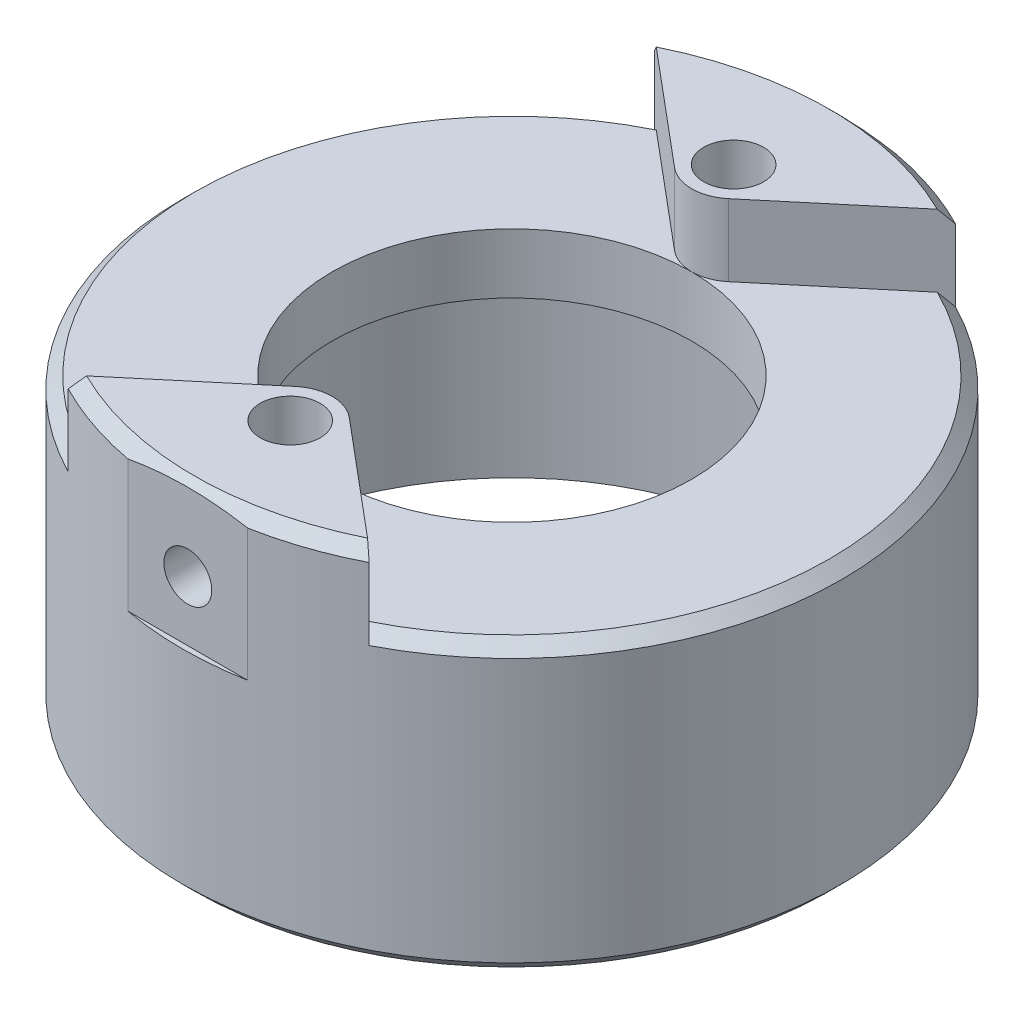
ISO-10303-21;
HEADER;
FILE_DESCRIPTION(('STEP AP214'),'2;1');
FILE_NAME('part.step','',(''),(''),'','','');
FILE_SCHEMA(('AUTOMOTIVE_DESIGN { 1 0 10303 214 1 1 1 1 }'));
ENDSEC;
DATA;
#1=APPLICATION_CONTEXT('core data for automotive mechanical design processes');
#2=APPLICATION_PROTOCOL_DEFINITION('international standard','automotive_design',2000,#1);
#3=PRODUCT_CONTEXT('',#1,'mechanical');
#4=PRODUCT('Part','Part','',(#3));
#5=PRODUCT_RELATED_PRODUCT_CATEGORY('part','',(#4));
#6=PRODUCT_DEFINITION_FORMATION('','',#4);
#7=PRODUCT_DEFINITION_CONTEXT('part definition',#1,'design');
#8=PRODUCT_DEFINITION('design','',#6,#7);
#9=PRODUCT_DEFINITION_SHAPE('','',#8);
#10=(LENGTH_UNIT() NAMED_UNIT(*) SI_UNIT(.MILLI.,.METRE.));
#11=(NAMED_UNIT(*) PLANE_ANGLE_UNIT() SI_UNIT($,.RADIAN.));
#12=(NAMED_UNIT(*) SI_UNIT($,.STERADIAN.) SOLID_ANGLE_UNIT());
#13=UNCERTAINTY_MEASURE_WITH_UNIT(LENGTH_MEASURE(1.E-05),#10,'distance_accuracy_value','');
#14=(GEOMETRIC_REPRESENTATION_CONTEXT(3) GLOBAL_UNCERTAINTY_ASSIGNED_CONTEXT((#13)) GLOBAL_UNIT_ASSIGNED_CONTEXT((#10,
#11,#12)) REPRESENTATION_CONTEXT('',''));
#15=CARTESIAN_POINT('',(0.,0.,0.));
#16=DIRECTION('',(0.,0.,1.));
#17=DIRECTION('',(1.,0.,0.));
#18=AXIS2_PLACEMENT_3D('',#15,#16,#17);
#19=CARTESIAN_POINT('',(0.,30.,0.));
#20=DIRECTION('',(0.,-1.,0.));
#21=DIRECTION('',(0.,0.,-1.));
#22=AXIS2_PLACEMENT_3D('',#19,#20,#21);
#23=CYLINDRICAL_SURFACE('',#22,27.5);
#24=CARTESIAN_POINT('',(0.,1.00000000000001,0.));
#25=DIRECTION('',(0.,1.,0.));
#26=DIRECTION('',(0.,0.,1.));
#27=AXIS2_PLACEMENT_3D('',#24,#25,#26);
#28=CIRCLE('',#27,27.5);
#29=CARTESIAN_POINT('',(0.,1.00000000000001,27.5));
#30=VERTEX_POINT('',#29);
#31=EDGE_CURVE('E453',#30,#30,#28,.T.);
#32=ORIENTED_EDGE('',*,*,#31,.T.);
#33=EDGE_LOOP('',(#32));
#34=FACE_BOUND('',#33,.T.);
#35=DIRECTION('',(0.,1.,0.));
#36=VECTOR('',#35,1.);
#37=CARTESIAN_POINT('',(12.55557835335,24.,24.4664556528503));
#38=LINE('',#37,#36);
#39=CARTESIAN_POINT('',(12.55557835335,23.,24.4664556528503));
#40=VERTEX_POINT('',#39);
#41=CARTESIAN_POINT('',(12.55557835335,29.,24.4664556528503));
#42=VERTEX_POINT('',#41);
#43=EDGE_CURVE('E247',#40,#42,#38,.T.);
#44=ORIENTED_EDGE('',*,*,#43,.T.);
#45=CARTESIAN_POINT('',(0.,29.,0.));
#46=DIRECTION('',(0.,1.,0.));
#47=DIRECTION('',(0.,0.,1.));
#48=AXIS2_PLACEMENT_3D('',#45,#46,#47);
#49=CIRCLE('',#48,27.5);
#50=CARTESIAN_POINT('',(5.,29.,27.0416345659799));
#51=VERTEX_POINT('',#50);
#52=EDGE_CURVE('E180',#42,#51,#49,.F.);
#53=ORIENTED_EDGE('',*,*,#52,.T.);
#54=DIRECTION('',(0.,-1.,0.));
#55=VECTOR('',#54,1.);
#56=CARTESIAN_POINT('',(5.,30.,27.0416345659799));
#57=LINE('',#56,#55);
#58=CARTESIAN_POINT('',(5.,18.,27.0416345659799));
#59=VERTEX_POINT('',#58);
#60=EDGE_CURVE('E173',#51,#59,#57,.T.);
#61=ORIENTED_EDGE('',*,*,#60,.T.);
#62=CARTESIAN_POINT('',(0.,18.,0.));
#63=DIRECTION('',(0.,1.,0.));
#64=DIRECTION('',(0.,0.,1.));
#65=AXIS2_PLACEMENT_3D('',#62,#63,#64);
#66=CIRCLE('',#65,27.5);
#67=CARTESIAN_POINT('',(-5.,18.,27.0416345659799));
#68=VERTEX_POINT('',#67);
#69=EDGE_CURVE('E172',#68,#59,#66,.T.);
#70=ORIENTED_EDGE('',*,*,#69,.F.);
#71=DIRECTION('',(0.,-1.,0.));
#72=VECTOR('',#71,1.);
#73=CARTESIAN_POINT('',(-5.,30.,27.0416345659799));
#74=LINE('',#73,#72);
#75=CARTESIAN_POINT('',(-5.,29.,27.0416345659799));
#76=VERTEX_POINT('',#75);
#77=EDGE_CURVE('E182',#76,#68,#74,.T.);
#78=ORIENTED_EDGE('',*,*,#77,.F.);
#79=CARTESIAN_POINT('',(0.,29.,0.));
#80=DIRECTION('',(0.,1.,0.));
#81=DIRECTION('',(0.,0.,1.));
#82=AXIS2_PLACEMENT_3D('',#79,#80,#81);
#83=CIRCLE('',#82,27.5);
#84=CARTESIAN_POINT('',(-12.5555783533498,29.,24.4664556528504));
#85=VERTEX_POINT('',#84);
#86=EDGE_CURVE('E456',#76,#85,#83,.F.);
#87=ORIENTED_EDGE('',*,*,#86,.T.);
#88=DIRECTION('',(0.,1.,0.));
#89=VECTOR('',#88,1.);
#90=CARTESIAN_POINT('',(-12.5555783533498,24.,24.4664556528504));
#91=LINE('',#90,#89);
#92=CARTESIAN_POINT('',(-12.5555783533498,23.,24.4664556528504));
#93=VERTEX_POINT('',#92);
#94=EDGE_CURVE('E245',#93,#85,#91,.T.);
#95=ORIENTED_EDGE('',*,*,#94,.F.);
#96=CARTESIAN_POINT('',(0.,23.,0.));
#97=DIRECTION('',(0.,1.,0.));
#98=DIRECTION('',(0.,0.,1.));
#99=AXIS2_PLACEMENT_3D('',#96,#97,#98);
#100=CIRCLE('',#99,27.5);
#101=CARTESIAN_POINT('',(-12.5555783533498,23.,-24.4664556528504));
#102=VERTEX_POINT('',#101);
#103=EDGE_CURVE('E449',#93,#102,#100,.F.);
#104=ORIENTED_EDGE('',*,*,#103,.T.);
#105=DIRECTION('',(0.,1.,0.));
#106=VECTOR('',#105,1.);
#107=CARTESIAN_POINT('',(-12.5555783533498,24.,-24.4664556528504));
#108=LINE('',#107,#106);
#109=CARTESIAN_POINT('',(-12.5555783533498,29.,-24.4664556528504));
#110=VERTEX_POINT('',#109);
#111=EDGE_CURVE('E239',#102,#110,#108,.T.);
#112=ORIENTED_EDGE('',*,*,#111,.T.);
#113=CARTESIAN_POINT('',(0.,29.,0.));
#114=DIRECTION('',(0.,1.,0.));
#115=DIRECTION('',(0.,0.,1.));
#116=AXIS2_PLACEMENT_3D('',#113,#114,#115);
#117=CIRCLE('',#116,27.5);
#118=CARTESIAN_POINT('',(-5.,29.,-27.0416345659799));
#119=VERTEX_POINT('',#118);
#120=EDGE_CURVE('E451',#110,#119,#117,.F.);
#121=ORIENTED_EDGE('',*,*,#120,.T.);
#122=DIRECTION('',(0.,-1.,0.));
#123=VECTOR('',#122,1.);
#124=CARTESIAN_POINT('',(-5.,30.,-27.0416345659799));
#125=LINE('',#124,#123);
#126=CARTESIAN_POINT('',(-5.,18.,-27.0416345659799));
#127=VERTEX_POINT('',#126);
#128=EDGE_CURVE('E194',#119,#127,#125,.T.);
#129=ORIENTED_EDGE('',*,*,#128,.T.);
#130=CARTESIAN_POINT('',(0.,18.,0.));
#131=DIRECTION('',(0.,1.,0.));
#132=DIRECTION('',(0.,0.,-1.));
#133=AXIS2_PLACEMENT_3D('',#130,#131,#132);
#134=CIRCLE('',#133,27.5);
#135=CARTESIAN_POINT('',(5.,18.,-27.0416345659799));
#136=VERTEX_POINT('',#135);
#137=EDGE_CURVE('E190',#136,#127,#134,.T.);
#138=ORIENTED_EDGE('',*,*,#137,.F.);
#139=DIRECTION('',(0.,-1.,0.));
#140=VECTOR('',#139,1.);
#141=CARTESIAN_POINT('',(5.,30.,-27.0416345659799));
#142=LINE('',#141,#140);
#143=CARTESIAN_POINT('',(5.,29.,-27.0416345659799));
#144=VERTEX_POINT('',#143);
#145=EDGE_CURVE('E198',#144,#136,#142,.T.);
#146=ORIENTED_EDGE('',*,*,#145,.F.);
#147=CARTESIAN_POINT('',(0.,29.,0.));
#148=DIRECTION('',(0.,1.,0.));
#149=DIRECTION('',(0.,0.,1.));
#150=AXIS2_PLACEMENT_3D('',#147,#148,#149);
#151=CIRCLE('',#150,27.5);
#152=CARTESIAN_POINT('',(12.55557835335,29.,-24.4664556528503));
#153=VERTEX_POINT('',#152);
#154=EDGE_CURVE('E447',#144,#153,#151,.F.);
#155=ORIENTED_EDGE('',*,*,#154,.T.);
#156=DIRECTION('',(0.,1.,0.));
#157=VECTOR('',#156,1.);
#158=CARTESIAN_POINT('',(12.55557835335,24.,-24.4664556528503));
#159=LINE('',#158,#157);
#160=CARTESIAN_POINT('',(12.55557835335,23.,-24.4664556528503));
#161=VERTEX_POINT('',#160);
#162=EDGE_CURVE('E252',#161,#153,#159,.T.);
#163=ORIENTED_EDGE('',*,*,#162,.F.);
#164=CARTESIAN_POINT('',(0.,23.,0.));
#165=DIRECTION('',(0.,1.,0.));
#166=DIRECTION('',(0.,0.,1.));
#167=AXIS2_PLACEMENT_3D('',#164,#165,#166);
#168=CIRCLE('',#167,27.5);
#169=EDGE_CURVE('E295',#161,#40,#168,.F.);
#170=ORIENTED_EDGE('',*,*,#169,.T.);
#171=EDGE_LOOP('',(#44,#53,#61,#70,#78,#87,#95,#104,#112,#121,#129,#138,#146,#155,#163,#170));
#172=FACE_BOUND('',#171,.T.);
#173=ADVANCED_FACE('F43',(#34,#172),#23,.T.);
#174=CARTESIAN_POINT('',(0.,30.,0.));
#175=DIRECTION('',(0.,-1.,0.));
#176=DIRECTION('',(0.,0.,-1.));
#177=AXIS2_PLACEMENT_3D('',#174,#175,#176);
#178=CYLINDRICAL_SURFACE('',#177,15.);
#179=CARTESIAN_POINT('',(0.,19.,0.));
#180=DIRECTION('',(0.,-1.,0.));
#181=DIRECTION('',(0.,0.,-1.));
#182=AXIS2_PLACEMENT_3D('',#179,#180,#181);
#183=CIRCLE('',#182,15.);
#184=CARTESIAN_POINT('',(0.,19.,-15.));
#185=VERTEX_POINT('',#184);
#186=EDGE_CURVE('E275',#185,#185,#183,.T.);
#187=ORIENTED_EDGE('',*,*,#186,.T.);
#188=EDGE_LOOP('',(#187));
#189=FACE_BOUND('',#188,.T.);
#190=CARTESIAN_POINT('',(0.,24.,0.));
#191=DIRECTION('',(0.,1.,0.));
#192=DIRECTION('',(0.,0.,1.));
#193=AXIS2_PLACEMENT_3D('',#190,#191,#192);
#194=CIRCLE('',#193,15.);
#195=CARTESIAN_POINT('',(0.,24.,-15.));
#196=VERTEX_POINT('',#195);
#197=CARTESIAN_POINT('',(0.,24.,15.));
#198=VERTEX_POINT('',#197);
#199=EDGE_CURVE('E256',#196,#198,#194,.T.);
#200=ORIENTED_EDGE('',*,*,#199,.T.);
#201=EDGE_CURVE('E261',#198,#196,#194,.T.);
#202=ORIENTED_EDGE('',*,*,#201,.T.);
#203=EDGE_LOOP('',(#200,#202));
#204=FACE_BOUND('',#203,.T.);
#205=ADVANCED_FACE('F367',(#189,#204),#178,.F.);
#206=CARTESIAN_POINT('',(0.,30.,0.));
#207=DIRECTION('',(0.,1.,0.));
#208=DIRECTION('',(0.,0.,1.));
#209=AXIS2_PLACEMENT_3D('',#206,#207,#208);
#210=PLANE('',#209);
#211=CARTESIAN_POINT('',(0.,30.,0.));
#212=DIRECTION('',(0.,1.,0.));
#213=DIRECTION('',(0.,0.,1.));
#214=AXIS2_PLACEMENT_3D('',#211,#212,#213);
#215=CIRCLE('',#214,26.5);
#216=CARTESIAN_POINT('',(-11.7215959154197,30.,23.7666612967749));
#217=VERTEX_POINT('',#216);
#218=CARTESIAN_POINT('',(11.7215959154198,30.,23.7666612967748));
#219=VERTEX_POINT('',#218);
#220=EDGE_CURVE('E283',#217,#219,#215,.T.);
#221=ORIENTED_EDGE('',*,*,#220,.T.);
#222=DIRECTION('',(0.766044443118984,0.,0.642787609686532));
#223=VECTOR('',#222,1.);
#224=CARTESIAN_POINT('',(2.24975663390286,30.,15.8188444490836));
#225=LINE('',#224,#223);
#226=CARTESIAN_POINT('',(2.24975663390286,30.,15.8188444490836));
#227=VERTEX_POINT('',#226);
#228=EDGE_CURVE('E230',#227,#219,#225,.T.);
#229=ORIENTED_EDGE('',*,*,#228,.F.);
#230=CARTESIAN_POINT('',(0.,30.,18.5));
#231=DIRECTION('',(0.,1.,0.));
#232=DIRECTION('',(0.,0.,1.));
#233=AXIS2_PLACEMENT_3D('',#230,#231,#232);
#234=CIRCLE('',#233,3.5);
#235=CARTESIAN_POINT('',(-2.2497566339029,30.,15.8188444490836));
#236=VERTEX_POINT('',#235);
#237=EDGE_CURVE('E227',#227,#236,#234,.T.);
#238=ORIENTED_EDGE('',*,*,#237,.T.);
#239=DIRECTION('',(-0.766044443118975,0.,0.642787609686543));
#240=VECTOR('',#239,1.);
#241=CARTESIAN_POINT('',(-2.2497566339029,30.,15.8188444490836));
#242=LINE('',#241,#240);
#243=EDGE_CURVE('E235',#236,#217,#242,.T.);
#244=ORIENTED_EDGE('',*,*,#243,.T.);
#245=EDGE_LOOP('',(#221,#229,#238,#244));
#246=FACE_BOUND('',#245,.T.);
#247=CARTESIAN_POINT('',(0.,30.,18.5));
#248=DIRECTION('',(0.,1.,0.));
#249=DIRECTION('',(0.,0.,1.));
#250=AXIS2_PLACEMENT_3D('',#247,#248,#249);
#251=CIRCLE('',#250,2.5);
#252=CARTESIAN_POINT('',(0.,30.,21.));
#253=VERTEX_POINT('',#252);
#254=EDGE_CURVE('E274',#253,#253,#251,.T.);
#255=ORIENTED_EDGE('',*,*,#254,.F.);
#256=EDGE_LOOP('',(#255));
#257=FACE_BOUND('',#256,.T.);
#258=ADVANCED_FACE('F380',(#246,#257),#210,.T.);
#259=CARTESIAN_POINT('',(0.,30.,-18.5));
#260=DIRECTION('',(0.,-1.,0.));
#261=DIRECTION('',(0.,0.,-1.));
#262=AXIS2_PLACEMENT_3D('',#259,#260,#261);
#263=CYLINDRICAL_SURFACE('',#262,2.5);
#264=CARTESIAN_POINT('',(0.,30.,-18.5));
#265=DIRECTION('',(0.,1.,0.));
#266=DIRECTION('',(0.,0.,1.));
#267=AXIS2_PLACEMENT_3D('',#264,#265,#266);
#268=CIRCLE('',#267,2.5);
#269=CARTESIAN_POINT('',(0.,30.,-16.));
#270=VERTEX_POINT('',#269);
#271=EDGE_CURVE('E279',#270,#270,#268,.T.);
#272=ORIENTED_EDGE('',*,*,#271,.T.);
#273=EDGE_LOOP('',(#272));
#274=FACE_BOUND('',#273,.T.);
#275=CARTESIAN_POINT('',(0.,19.,-18.5));
#276=DIRECTION('',(0.,-1.,0.));
#277=DIRECTION('',(0.,0.,-1.));
#278=AXIS2_PLACEMENT_3D('',#275,#276,#277);
#279=CIRCLE('',#278,2.5);
#280=CARTESIAN_POINT('',(0.,19.,-21.));
#281=VERTEX_POINT('',#280);
#282=EDGE_CURVE('E267',#281,#281,#279,.T.);
#283=ORIENTED_EDGE('',*,*,#282,.T.);
#284=EDGE_LOOP('',(#283));
#285=FACE_BOUND('',#284,.T.);
#286=ADVANCED_FACE('F395',(#274,#285),#263,.F.);
#287=CARTESIAN_POINT('',(0.,30.,18.5));
#288=DIRECTION('',(0.,-1.,0.));
#289=DIRECTION('',(0.,0.,-1.));
#290=AXIS2_PLACEMENT_3D('',#287,#288,#289);
#291=CYLINDRICAL_SURFACE('',#290,2.5);
#292=ORIENTED_EDGE('',*,*,#254,.T.);
#293=EDGE_LOOP('',(#292));
#294=FACE_BOUND('',#293,.T.);
#295=CARTESIAN_POINT('',(0.,19.,18.5));
#296=DIRECTION('',(0.,-1.,0.));
#297=DIRECTION('',(0.,0.,-1.));
#298=AXIS2_PLACEMENT_3D('',#295,#296,#297);
#299=CIRCLE('',#298,2.5);
#300=CARTESIAN_POINT('',(0.,19.,16.));
#301=VERTEX_POINT('',#300);
#302=EDGE_CURVE('E264',#301,#301,#299,.T.);
#303=ORIENTED_EDGE('',*,*,#302,.T.);
#304=EDGE_LOOP('',(#303));
#305=FACE_BOUND('',#304,.T.);
#306=ADVANCED_FACE('F386',(#294,#305),#291,.F.);
#307=CARTESIAN_POINT('',(0.,30.,0.));
#308=DIRECTION('',(0.,1.,0.));
#309=DIRECTION('',(0.,0.,1.));
#310=AXIS2_PLACEMENT_3D('',#307,#308,#309);
#311=CIRCLE('',#310,26.5);
#312=CARTESIAN_POINT('',(11.7215959154199,30.,-23.7666612967748));
#313=VERTEX_POINT('',#312);
#314=CARTESIAN_POINT('',(-11.7215959154197,30.,-23.7666612967749));
#315=VERTEX_POINT('',#314);
#316=EDGE_CURVE('E497',#313,#315,#311,.T.);
#317=ORIENTED_EDGE('',*,*,#316,.T.);
#318=DIRECTION('',(-0.766044443118975,0.,-0.642787609686543));
#319=VECTOR('',#318,1.);
#320=CARTESIAN_POINT('',(-2.2497566339029,30.,-15.8188444490836));
#321=LINE('',#320,#319);
#322=CARTESIAN_POINT('',(-2.2497566339029,30.,-15.8188444490836));
#323=VERTEX_POINT('',#322);
#324=EDGE_CURVE('E232',#323,#315,#321,.T.);
#325=ORIENTED_EDGE('',*,*,#324,.F.);
#326=CARTESIAN_POINT('',(0.,30.,-18.5));
#327=DIRECTION('',(0.,1.,0.));
#328=DIRECTION('',(0.,0.,1.));
#329=AXIS2_PLACEMENT_3D('',#326,#327,#328);
#330=CIRCLE('',#329,3.5);
#331=CARTESIAN_POINT('',(2.24975663390286,30.,-15.8188444490836));
#332=VERTEX_POINT('',#331);
#333=EDGE_CURVE('E177',#323,#332,#330,.T.);
#334=ORIENTED_EDGE('',*,*,#333,.T.);
#335=DIRECTION('',(0.766044443118984,0.,-0.642787609686532));
#336=VECTOR('',#335,1.);
#337=CARTESIAN_POINT('',(2.24975663390286,30.,-15.8188444490836));
#338=LINE('',#337,#336);
#339=EDGE_CURVE('E221',#332,#313,#338,.T.);
#340=ORIENTED_EDGE('',*,*,#339,.T.);
#341=EDGE_LOOP('',(#317,#325,#334,#340));
#342=FACE_BOUND('',#341,.T.);
#343=ORIENTED_EDGE('',*,*,#271,.F.);
#344=EDGE_LOOP('',(#343));
#345=FACE_BOUND('',#344,.T.);
#346=ADVANCED_FACE('F387',(#342,#345),#210,.T.);
#347=CARTESIAN_POINT('',(0.,0.,0.));
#348=DIRECTION('',(0.,1.,0.));
#349=DIRECTION('',(0.,0.,1.));
#350=AXIS2_PLACEMENT_3D('',#347,#348,#349);
#351=PLANE('',#350);
#352=CARTESIAN_POINT('',(0.,0.,0.));
#353=DIRECTION('',(0.,1.,0.));
#354=DIRECTION('',(0.,0.,1.));
#355=AXIS2_PLACEMENT_3D('',#352,#353,#354);
#356=CIRCLE('',#355,26.5);
#357=CARTESIAN_POINT('',(0.,0.,26.5));
#358=VERTEX_POINT('',#357);
#359=EDGE_CURVE('E439',#358,#358,#356,.F.);
#360=ORIENTED_EDGE('',*,*,#359,.T.);
#361=EDGE_LOOP('',(#360));
#362=FACE_BOUND('',#361,.T.);
#363=CARTESIAN_POINT('',(0.,0.,0.));
#364=DIRECTION('',(0.,-1.,0.));
#365=DIRECTION('',(0.,0.,-1.));
#366=AXIS2_PLACEMENT_3D('',#363,#364,#365);
#367=CIRCLE('',#366,23.5);
#368=CARTESIAN_POINT('',(0.,0.,-23.5));
#369=VERTEX_POINT('',#368);
#370=EDGE_CURVE('E266',#369,#369,#367,.T.);
#371=ORIENTED_EDGE('',*,*,#370,.F.);
#372=EDGE_LOOP('',(#371));
#373=FACE_BOUND('',#372,.T.);
#374=ADVANCED_FACE('F385',(#362,#373),#351,.F.);
#375=CARTESIAN_POINT('',(0.,19.,0.));
#376=DIRECTION('',(0.,-1.,0.));
#377=DIRECTION('',(0.,0.,-1.));
#378=AXIS2_PLACEMENT_3D('',#375,#376,#377);
#379=CYLINDRICAL_SURFACE('',#378,23.5);
#380=CARTESIAN_POINT('',(0.,19.,0.));
#381=DIRECTION('',(0.,-1.,0.));
#382=DIRECTION('',(0.,0.,-1.));
#383=AXIS2_PLACEMENT_3D('',#380,#381,#382);
#384=CIRCLE('',#383,23.5);
#385=CARTESIAN_POINT('',(0.,19.,-23.5));
#386=VERTEX_POINT('',#385);
#387=EDGE_CURVE('E265',#386,#386,#384,.T.);
#388=ORIENTED_EDGE('',*,*,#387,.F.);
#389=EDGE_LOOP('',(#388));
#390=FACE_BOUND('',#389,.T.);
#391=ORIENTED_EDGE('',*,*,#370,.T.);
#392=EDGE_LOOP('',(#391));
#393=FACE_BOUND('',#392,.T.);
#394=ADVANCED_FACE('F384',(#390,#393),#379,.F.);
#395=CARTESIAN_POINT('',(0.,19.,0.));
#396=DIRECTION('',(0.,-1.,0.));
#397=DIRECTION('',(0.,0.,-1.));
#398=AXIS2_PLACEMENT_3D('',#395,#396,#397);
#399=PLANE('',#398);
#400=ORIENTED_EDGE('',*,*,#186,.F.);
#401=EDGE_LOOP('',(#400));
#402=FACE_BOUND('',#401,.T.);
#403=ORIENTED_EDGE('',*,*,#282,.F.);
#404=EDGE_LOOP('',(#403));
#405=FACE_BOUND('',#404,.T.);
#406=ORIENTED_EDGE('',*,*,#302,.F.);
#407=EDGE_LOOP('',(#406));
#408=FACE_BOUND('',#407,.T.);
#409=ORIENTED_EDGE('',*,*,#387,.T.);
#410=EDGE_LOOP('',(#409));
#411=FACE_BOUND('',#410,.T.);
#412=ADVANCED_FACE('F397',(#402,#405,#408,#411),#399,.T.);
#413=CARTESIAN_POINT('',(0.,24.,-18.5));
#414=DIRECTION('',(0.,1.,0.));
#415=DIRECTION('',(0.,0.,1.));
#416=AXIS2_PLACEMENT_3D('',#413,#414,#415);
#417=CYLINDRICAL_SURFACE('',#416,3.5);
#418=CARTESIAN_POINT('',(0.,24.,-18.5));
#419=DIRECTION('',(0.,1.,0.));
#420=DIRECTION('',(0.,0.,1.));
#421=AXIS2_PLACEMENT_3D('',#418,#419,#420);
#422=CIRCLE('',#421,3.5);
#423=CARTESIAN_POINT('',(-2.2497566339029,24.,-15.8188444490836));
#424=VERTEX_POINT('',#423);
#425=EDGE_CURVE('E204',#424,#196,#422,.T.);
#426=ORIENTED_EDGE('',*,*,#425,.T.);
#427=CARTESIAN_POINT('',(2.24975663390286,24.,-15.8188444490836));
#428=VERTEX_POINT('',#427);
#429=EDGE_CURVE('E208',#196,#428,#422,.T.);
#430=ORIENTED_EDGE('',*,*,#429,.T.);
#431=DIRECTION('',(0.,1.,0.));
#432=VECTOR('',#431,1.);
#433=CARTESIAN_POINT('',(2.24975663390286,24.,-15.8188444490836));
#434=LINE('',#433,#432);
#435=EDGE_CURVE('E254',#428,#332,#434,.T.);
#436=ORIENTED_EDGE('',*,*,#435,.T.);
#437=ORIENTED_EDGE('',*,*,#333,.F.);
#438=DIRECTION('',(0.,1.,0.));
#439=VECTOR('',#438,1.);
#440=CARTESIAN_POINT('',(-2.2497566339029,24.,-15.8188444490836));
#441=LINE('',#440,#439);
#442=EDGE_CURVE('E225',#424,#323,#441,.T.);
#443=ORIENTED_EDGE('',*,*,#442,.F.);
#444=EDGE_LOOP('',(#426,#430,#436,#437,#443));
#445=FACE_BOUND('',#444,.T.);
#446=ADVANCED_FACE('F312',(#445),#417,.T.);
#447=CARTESIAN_POINT('',(0.,24.,18.5));
#448=DIRECTION('',(0.,1.,0.));
#449=DIRECTION('',(0.,0.,1.));
#450=AXIS2_PLACEMENT_3D('',#447,#448,#449);
#451=CYLINDRICAL_SURFACE('',#450,3.5);
#452=CARTESIAN_POINT('',(0.,24.,18.5));
#453=DIRECTION('',(0.,1.,0.));
#454=DIRECTION('',(0.,0.,1.));
#455=AXIS2_PLACEMENT_3D('',#452,#453,#454);
#456=CIRCLE('',#455,3.5);
#457=CARTESIAN_POINT('',(2.24975663390286,24.,15.8188444490836));
#458=VERTEX_POINT('',#457);
#459=EDGE_CURVE('E214',#458,#198,#456,.T.);
#460=ORIENTED_EDGE('',*,*,#459,.T.);
#461=CARTESIAN_POINT('',(-2.2497566339029,24.,15.8188444490836));
#462=VERTEX_POINT('',#461);
#463=EDGE_CURVE('E212',#198,#462,#456,.T.);
#464=ORIENTED_EDGE('',*,*,#463,.T.);
#465=DIRECTION('',(0.,1.,0.));
#466=VECTOR('',#465,1.);
#467=CARTESIAN_POINT('',(-2.2497566339029,24.,15.8188444490836));
#468=LINE('',#467,#466);
#469=EDGE_CURVE('E242',#462,#236,#468,.T.);
#470=ORIENTED_EDGE('',*,*,#469,.T.);
#471=ORIENTED_EDGE('',*,*,#237,.F.);
#472=DIRECTION('',(0.,1.,0.));
#473=VECTOR('',#472,1.);
#474=CARTESIAN_POINT('',(2.24975663390286,24.,15.8188444490836));
#475=LINE('',#474,#473);
#476=EDGE_CURVE('E246',#458,#227,#475,.T.);
#477=ORIENTED_EDGE('',*,*,#476,.F.);
#478=EDGE_LOOP('',(#460,#464,#470,#471,#477));
#479=FACE_BOUND('',#478,.T.);
#480=ADVANCED_FACE('F307',(#479),#451,.T.);
#481=CARTESIAN_POINT('',(0.,24.,-18.5));
#482=DIRECTION('',(0.,1.,0.));
#483=DIRECTION('',(0.,0.,1.));
#484=AXIS2_PLACEMENT_3D('',#481,#482,#483);
#485=PLANE('',#484);
#486=DIRECTION('',(0.766044443118984,0.,0.642787609686532));
#487=VECTOR('',#486,1.);
#488=CARTESIAN_POINT('',(2.24975663390286,24.,15.8188444490836));
#489=LINE('',#488,#487);
#490=CARTESIAN_POINT('',(11.7215959154199,24.,23.7666612967748));
#491=VERTEX_POINT('',#490);
#492=EDGE_CURVE('E211',#458,#491,#489,.T.);
#493=ORIENTED_EDGE('',*,*,#492,.T.);
#494=CARTESIAN_POINT('',(0.,24.,0.));
#495=DIRECTION('',(0.,1.,0.));
#496=DIRECTION('',(0.,0.,1.));
#497=AXIS2_PLACEMENT_3D('',#494,#495,#496);
#498=CIRCLE('',#497,26.5);
#499=CARTESIAN_POINT('',(11.7215959154199,24.,-23.7666612967748));
#500=VERTEX_POINT('',#499);
#501=EDGE_CURVE('E445',#491,#500,#498,.T.);
#502=ORIENTED_EDGE('',*,*,#501,.T.);
#503=DIRECTION('',(0.766044443118984,0.,-0.642787609686532));
#504=VECTOR('',#503,1.);
#505=CARTESIAN_POINT('',(2.24975663390286,24.,-15.8188444490836));
#506=LINE('',#505,#504);
#507=EDGE_CURVE('E210',#428,#500,#506,.T.);
#508=ORIENTED_EDGE('',*,*,#507,.F.);
#509=ORIENTED_EDGE('',*,*,#429,.F.);
#510=ORIENTED_EDGE('',*,*,#201,.F.);
#511=ORIENTED_EDGE('',*,*,#459,.F.);
#512=EDGE_LOOP('',(#493,#502,#508,#509,#510,#511));
#513=FACE_BOUND('',#512,.T.);
#514=ADVANCED_FACE('F311',(#513),#485,.T.);
#515=CARTESIAN_POINT('',(2.24975663390286,24.,-15.8188444490836));
#516=DIRECTION('',(0.642787609686532,0.,0.766044443118984));
#517=DIRECTION('',(0.766044443118984,0.,-0.642787609686532));
#518=AXIS2_PLACEMENT_3D('',#515,#516,#517);
#519=PLANE('',#518);
#520=ORIENTED_EDGE('',*,*,#162,.T.);
#521=CARTESIAN_POINT('',(12.55557835335,29.,-24.4664556528503));
#522=CARTESIAN_POINT('',(12.4167994776618,29.1669767592989,-24.3500063494452));
#523=CARTESIAN_POINT('',(12.2779115042648,29.3337984711569,-24.2334655021928));
#524=CARTESIAN_POINT('',(11.999917358294,29.6671318044986,-24.0002007168392));
#525=CARTESIAN_POINT('',(11.8608111857143,29.8336434259739,-23.8834767787331));
#526=CARTESIAN_POINT('',(11.7215959154199,30.,-23.7666612967748));
#527=B_SPLINE_CURVE_WITH_KNOTS('',3,(#521,#522,#523,#524,#525,#526),.UNSPECIFIED.,.F.,.F.,(4,2,
4),(0.,0.739127929399817,1.47825587878883),.UNSPECIFIED.);
#528=EDGE_CURVE('E317',#153,#313,#527,.T.);
#529=ORIENTED_EDGE('',*,*,#528,.T.);
#530=ORIENTED_EDGE('',*,*,#339,.F.);
#531=ORIENTED_EDGE('',*,*,#435,.F.);
#532=ORIENTED_EDGE('',*,*,#507,.T.);
#533=CARTESIAN_POINT('',(11.7215959154199,24.,-23.7666612967748));
#534=CARTESIAN_POINT('',(11.8608111857143,23.8336434259739,-23.8834767787331));
#535=CARTESIAN_POINT('',(11.999917358294,23.6671318044986,-24.0002007168392));
#536=CARTESIAN_POINT('',(12.2779115042648,23.3337984711569,-24.2334655021928));
#537=CARTESIAN_POINT('',(12.4167994776618,23.1669767592989,-24.3500063494452));
#538=CARTESIAN_POINT('',(12.55557835335,23.,-24.4664556528503));
#539=B_SPLINE_CURVE_WITH_KNOTS('',3,(#533,#534,#535,#536,#537,#538),.UNSPECIFIED.,.F.,.F.,(4,2,
4),(0.,0.739127949389006,1.47825587878882),.UNSPECIFIED.);
#540=EDGE_CURVE('E59',#500,#161,#539,.T.);
#541=ORIENTED_EDGE('',*,*,#540,.T.);
#542=EDGE_LOOP('',(#520,#529,#530,#531,#532,#541));
#543=FACE_BOUND('',#542,.T.);
#544=ADVANCED_FACE('F302',(#543),#519,.T.);
#545=CARTESIAN_POINT('',(2.24975663390286,24.,15.8188444490836));
#546=DIRECTION('',(-0.642787609686532,0.,0.766044443118984));
#547=DIRECTION('',(0.766044443118984,0.,0.642787609686532));
#548=AXIS2_PLACEMENT_3D('',#545,#546,#547);
#549=PLANE('',#548);
#550=ORIENTED_EDGE('',*,*,#228,.T.);
#551=CARTESIAN_POINT('',(11.7215959154198,30.,23.7666612967748));
#552=CARTESIAN_POINT('',(11.8608111857143,29.8336434259739,23.8834767787331));
#553=CARTESIAN_POINT('',(11.999917358294,29.6671318044986,24.0002007168392));
#554=CARTESIAN_POINT('',(12.2779115042648,29.3337984711569,24.2334655021928));
#555=CARTESIAN_POINT('',(12.4167994776618,29.1669767592989,24.3500063494452));
#556=CARTESIAN_POINT('',(12.55557835335,29.,24.4664556528503));
#557=B_SPLINE_CURVE_WITH_KNOTS('',3,(#551,#552,#553,#554,#555,#556),.UNSPECIFIED.,.F.,.F.,(4,2,
4),(0.,0.739127949389028,1.47825587878886),.UNSPECIFIED.);
#558=EDGE_CURVE('E282',#219,#42,#557,.T.);
#559=ORIENTED_EDGE('',*,*,#558,.T.);
#560=ORIENTED_EDGE('',*,*,#43,.F.);
#561=CARTESIAN_POINT('',(12.55557835335,23.,24.4664556528503));
#562=CARTESIAN_POINT('',(12.4167994776618,23.1669767592989,24.3500063494452));
#563=CARTESIAN_POINT('',(12.2779115042648,23.3337984711569,24.2334655021928));
#564=CARTESIAN_POINT('',(11.999917358294,23.6671318044986,24.0002007168392));
#565=CARTESIAN_POINT('',(11.8608111857143,23.8336434259739,23.8834767787331));
#566=CARTESIAN_POINT('',(11.7215959154199,24.,23.7666612967748));
#567=B_SPLINE_CURVE_WITH_KNOTS('',3,(#561,#562,#563,#564,#565,#566),.UNSPECIFIED.,.F.,.F.,(4,2,
4),(0.,0.739127929399817,1.47825587878882),.UNSPECIFIED.);
#568=EDGE_CURVE('E11',#40,#491,#567,.T.);
#569=ORIENTED_EDGE('',*,*,#568,.T.);
#570=ORIENTED_EDGE('',*,*,#492,.F.);
#571=ORIENTED_EDGE('',*,*,#476,.T.);
#572=EDGE_LOOP('',(#550,#559,#560,#569,#570,#571));
#573=FACE_BOUND('',#572,.T.);
#574=ADVANCED_FACE('F299',(#573),#549,.F.);
#575=CARTESIAN_POINT('',(-2.2497566339029,24.,15.8188444490836));
#576=DIRECTION('',(-0.642787609686543,0.,-0.766044443118974));
#577=DIRECTION('',(-0.766044443118975,0.,0.642787609686544));
#578=AXIS2_PLACEMENT_3D('',#575,#576,#577);
#579=PLANE('',#578);
#580=ORIENTED_EDGE('',*,*,#94,.T.);
#581=CARTESIAN_POINT('',(-12.5555783533498,29.,24.4664556528504));
#582=CARTESIAN_POINT('',(-12.4167994776616,29.1669767592989,24.3500063494452));
#583=CARTESIAN_POINT('',(-12.2779115042646,29.3337984711569,24.2334655021929));
#584=CARTESIAN_POINT('',(-11.9999173582938,29.6671318044986,24.0002007168393));
#585=CARTESIAN_POINT('',(-11.8608111857141,29.8336434259739,23.8834767787332));
#586=CARTESIAN_POINT('',(-11.7215959154197,30.,23.7666612967749));
#587=B_SPLINE_CURVE_WITH_KNOTS('',3,(#581,#582,#583,#584,#585,#586),.UNSPECIFIED.,.F.,.F.,(4,2,
4),(0.,0.739127929399828,1.47825587878885),.UNSPECIFIED.);
#588=EDGE_CURVE('E466',#85,#217,#587,.T.);
#589=ORIENTED_EDGE('',*,*,#588,.T.);
#590=ORIENTED_EDGE('',*,*,#243,.F.);
#591=ORIENTED_EDGE('',*,*,#469,.F.);
#592=DIRECTION('',(-0.766044443118975,0.,0.642787609686543));
#593=VECTOR('',#592,1.);
#594=CARTESIAN_POINT('',(-2.2497566339029,24.,15.8188444490836));
#595=LINE('',#594,#593);
#596=CARTESIAN_POINT('',(-11.7215959154197,24.,23.7666612967749));
#597=VERTEX_POINT('',#596);
#598=EDGE_CURVE('E220',#462,#597,#595,.T.);
#599=ORIENTED_EDGE('',*,*,#598,.T.);
#600=CARTESIAN_POINT('',(-11.7215959154197,24.,23.7666612967749));
#601=CARTESIAN_POINT('',(-11.8608111857141,23.8336434259739,23.8834767787332));
#602=CARTESIAN_POINT('',(-11.9999173582938,23.6671318044986,24.0002007168393));
#603=CARTESIAN_POINT('',(-12.2779115042646,23.3337984711569,24.2334655021929));
#604=CARTESIAN_POINT('',(-12.4167994776616,23.1669767592989,24.3500063494453));
#605=CARTESIAN_POINT('',(-12.5555783533498,23.,24.4664556528504));
#606=B_SPLINE_CURVE_WITH_KNOTS('',3,(#600,#601,#602,#603,#604,#605),.UNSPECIFIED.,.F.,.F.,(4,2,
4),(0.,0.739127949389005,1.47825587878882),.UNSPECIFIED.);
#607=EDGE_CURVE('E336',#597,#93,#606,.T.);
#608=ORIENTED_EDGE('',*,*,#607,.T.);
#609=EDGE_LOOP('',(#580,#589,#590,#591,#599,#608));
#610=FACE_BOUND('',#609,.T.);
#611=ADVANCED_FACE('F304',(#610),#579,.T.);
#612=CARTESIAN_POINT('',(-2.2497566339029,24.,-15.8188444490836));
#613=DIRECTION('',(0.642787609686543,0.,-0.766044443118974));
#614=DIRECTION('',(-0.766044443118975,0.,-0.642787609686544));
#615=AXIS2_PLACEMENT_3D('',#612,#613,#614);
#616=PLANE('',#615);
#617=ORIENTED_EDGE('',*,*,#324,.T.);
#618=CARTESIAN_POINT('',(-11.7215959154197,30.,-23.7666612967749));
#619=CARTESIAN_POINT('',(-11.8608111857141,29.8336434259739,-23.8834767787332));
#620=CARTESIAN_POINT('',(-11.9999173582938,29.6671318044986,-24.0002007168393));
#621=CARTESIAN_POINT('',(-12.2779115042646,29.3337984711569,-24.2334655021929));
#622=CARTESIAN_POINT('',(-12.4167994776616,29.1669767592989,-24.3500063494452));
#623=CARTESIAN_POINT('',(-12.5555783533498,29.,-24.4664556528504));
#624=B_SPLINE_CURVE_WITH_KNOTS('',3,(#618,#619,#620,#621,#622,#623),.UNSPECIFIED.,.F.,.F.,(4,2,
4),(0.,0.739127949389006,1.47825587878883),.UNSPECIFIED.);
#625=EDGE_CURVE('E491',#315,#110,#624,.T.);
#626=ORIENTED_EDGE('',*,*,#625,.T.);
#627=ORIENTED_EDGE('',*,*,#111,.F.);
#628=CARTESIAN_POINT('',(-12.5555783533498,23.,-24.4664556528504));
#629=CARTESIAN_POINT('',(-12.4167994776616,23.1669767592989,-24.3500063494453));
#630=CARTESIAN_POINT('',(-12.2779115042646,23.3337984711569,-24.2334655021929));
#631=CARTESIAN_POINT('',(-11.9999173582938,23.6671318044986,-24.0002007168393));
#632=CARTESIAN_POINT('',(-11.8608111857141,23.8336434259739,-23.8834767787332));
#633=CARTESIAN_POINT('',(-11.7215959154197,24.,-23.7666612967749));
#634=B_SPLINE_CURVE_WITH_KNOTS('',3,(#628,#629,#630,#631,#632,#633),.UNSPECIFIED.,.F.,.F.,(4,2,
4),(0.,0.739127929399815,1.47825587878882),.UNSPECIFIED.);
#635=CARTESIAN_POINT('',(-11.7215959154197,24.,-23.7666612967749));
#636=VERTEX_POINT('',#635);
#637=EDGE_CURVE('E75',#102,#636,#634,.T.);
#638=ORIENTED_EDGE('',*,*,#637,.T.);
#639=DIRECTION('',(-0.766044443118975,0.,-0.642787609686543));
#640=VECTOR('',#639,1.);
#641=CARTESIAN_POINT('',(-2.2497566339029,24.,-15.8188444490836));
#642=LINE('',#641,#640);
#643=EDGE_CURVE('E219',#424,#636,#642,.T.);
#644=ORIENTED_EDGE('',*,*,#643,.F.);
#645=ORIENTED_EDGE('',*,*,#442,.T.);
#646=EDGE_LOOP('',(#617,#626,#627,#638,#644,#645));
#647=FACE_BOUND('',#646,.T.);
#648=ADVANCED_FACE('F344',(#647),#616,.F.);
#649=ORIENTED_EDGE('',*,*,#643,.T.);
#650=CARTESIAN_POINT('',(0.,24.,0.));
#651=DIRECTION('',(0.,1.,0.));
#652=DIRECTION('',(0.,0.,1.));
#653=AXIS2_PLACEMENT_3D('',#650,#651,#652);
#654=CIRCLE('',#653,26.5);
#655=EDGE_CURVE('E440',#636,#597,#654,.T.);
#656=ORIENTED_EDGE('',*,*,#655,.T.);
#657=ORIENTED_EDGE('',*,*,#598,.F.);
#658=ORIENTED_EDGE('',*,*,#463,.F.);
#659=ORIENTED_EDGE('',*,*,#199,.F.);
#660=ORIENTED_EDGE('',*,*,#425,.F.);
#661=EDGE_LOOP('',(#649,#656,#657,#658,#659,#660));
#662=FACE_BOUND('',#661,.T.);
#663=ADVANCED_FACE('F430',(#662),#485,.T.);
#664=CARTESIAN_POINT('',(-5.,30.,-27.0416345659799));
#665=DIRECTION('',(0.,0.,-1.));
#666=DIRECTION('',(-1.,0.,0.));
#667=AXIS2_PLACEMENT_3D('',#664,#665,#666);
#668=PLANE('',#667);
#669=CARTESIAN_POINT('',(0.,23.,-27.0416345659799));
#670=DIRECTION('',(0.,0.,-1.));
#671=DIRECTION('',(-1.,0.,0.));
#672=AXIS2_PLACEMENT_3D('',#669,#670,#671);
#673=CIRCLE('',#672,2.);
#674=CARTESIAN_POINT('',(-2.00000000000001,23.,-27.0416345659799));
#675=VERTEX_POINT('',#674);
#676=EDGE_CURVE('E728',#675,#675,#673,.T.);
#677=ORIENTED_EDGE('',*,*,#676,.F.);
#678=EDGE_LOOP('',(#677));
#679=FACE_BOUND('',#678,.T.);
#680=ORIENTED_EDGE('',*,*,#128,.F.);
#681=CARTESIAN_POINT('',(-5.,29.,-27.0416345659799));
#682=CARTESIAN_POINT('',(-4.66291135266915,29.0613051131531,-27.0416345659799));
#683=CARTESIAN_POINT('',(-4.3247498203478,29.1167802743313,-27.0416345659799));
#684=CARTESIAN_POINT('',(-3.64663671460792,29.2156516132221,-27.0416345659799));
#685=CARTESIAN_POINT('',(-3.3066849833361,29.2590467069512,-27.0416345659799));
#686=CARTESIAN_POINT('',(-2.62527201264153,29.3333424884377,-27.0416345659799));
#687=CARTESIAN_POINT('',(-2.2838102254226,29.3642381878321,-27.0416345659799));
#688=CARTESIAN_POINT('',(-1.59999675784152,29.4132207735035,-27.0416345659799));
#689=CARTESIAN_POINT('',(-1.2576451127339,29.4313081596872,-27.0416345659799));
#690=CARTESIAN_POINT('',(-0.238932576822627,29.4657406492597,-27.0416345659799));
#691=CARTESIAN_POINT('',(0.438156270260195,29.463250115369,-27.0416345659799));
#692=CARTESIAN_POINT('',(1.78990544559399,29.4076056181883,-27.0416345659799));
#693=CARTESIAN_POINT('',(2.46456684620077,29.3544777838056,-27.0416345659799));
#694=CARTESIAN_POINT('',(3.29202277202238,29.2591599894089,-27.0416345659799));
#695=CARTESIAN_POINT('',(3.44765291470432,29.2399094754972,-27.0416345659799));
#696=CARTESIAN_POINT('',(3.75856253981973,29.1988447435424,-27.0416345659799));
#697=CARTESIAN_POINT('',(3.91384205948113,29.177030812113,-27.0416345659799));
#698=CARTESIAN_POINT('',(4.2245046008041,29.1308062569558,-27.0416345659799));
#699=CARTESIAN_POINT('',(4.37988645015357,29.106387790444,-27.0416345659799));
#700=CARTESIAN_POINT('',(4.6902530722683,29.055054324116,-27.0416345659799));
#701=CARTESIAN_POINT('',(4.84523780434321,29.028139078216,-27.0416345659799));
#702=CARTESIAN_POINT('',(5.,29.,-27.0416345659799));
#703=B_SPLINE_CURVE_WITH_KNOTS('',3,(#681,#682,#683,#684,#685,#686,#687,#688,#689,#690,#691,
#692,#693,#694,#695,#696,#697,#698,#699,#700,#701,#702),.UNSPECIFIED.,.F.,.F.,(4,2,2,2,2,2,2,2,
2,2,4),(0.,1.02782017015634,2.0557325402321,3.08405473446717,4.11233679121275,6.14159768643801,
8.16981204718399,8.64025268395535,9.1106407710631,9.58248757142621,10.0543809267506),.UNSPECIFIED.);
#704=EDGE_CURVE('E441',#119,#144,#703,.T.);
#705=ORIENTED_EDGE('',*,*,#704,.T.);
#706=ORIENTED_EDGE('',*,*,#145,.T.);
#707=DIRECTION('',(1.,0.,0.));
#708=VECTOR('',#707,1.);
#709=CARTESIAN_POINT('',(-5.,18.,-27.0416345659799));
#710=LINE('',#709,#708);
#711=EDGE_CURVE('E200',#127,#136,#710,.T.);
#712=ORIENTED_EDGE('',*,*,#711,.F.);
#713=EDGE_LOOP('',(#680,#705,#706,#712));
#714=FACE_BOUND('',#713,.T.);
#715=ADVANCED_FACE('F481',(#679,#714),#668,.T.);
#716=CARTESIAN_POINT('',(0.,18.,0.));
#717=DIRECTION('',(0.,-1.,0.));
#718=DIRECTION('',(0.,0.,-1.));
#719=AXIS2_PLACEMENT_3D('',#716,#717,#718);
#720=PLANE('',#719);
#721=ORIENTED_EDGE('',*,*,#137,.T.);
#722=ORIENTED_EDGE('',*,*,#711,.T.);
#723=EDGE_LOOP('',(#721,#722));
#724=FACE_BOUND('',#723,.T.);
#725=ADVANCED_FACE('F476',(#724),#720,.F.);
#726=CARTESIAN_POINT('',(-5.,30.,27.0416345659799));
#727=DIRECTION('',(0.,0.,1.));
#728=DIRECTION('',(1.,0.,0.));
#729=AXIS2_PLACEMENT_3D('',#726,#727,#728);
#730=PLANE('',#729);
#731=CARTESIAN_POINT('',(0.,23.,27.0416345659799));
#732=DIRECTION('',(0.,0.,-1.));
#733=DIRECTION('',(-1.,0.,0.));
#734=AXIS2_PLACEMENT_3D('',#731,#732,#733);
#735=CIRCLE('',#734,2.);
#736=CARTESIAN_POINT('',(-2.00000000000001,23.,27.0416345659799));
#737=VERTEX_POINT('',#736);
#738=EDGE_CURVE('E730',#737,#737,#735,.T.);
#739=ORIENTED_EDGE('',*,*,#738,.T.);
#740=EDGE_LOOP('',(#739));
#741=FACE_BOUND('',#740,.T.);
#742=ORIENTED_EDGE('',*,*,#60,.F.);
#743=CARTESIAN_POINT('',(5.,29.,27.0416345659799));
#744=CARTESIAN_POINT('',(4.66291135266915,29.0613051131531,27.0416345659799));
#745=CARTESIAN_POINT('',(4.3247498203478,29.1167802743313,27.0416345659799));
#746=CARTESIAN_POINT('',(3.64663671460793,29.2156516132221,27.0416345659799));
#747=CARTESIAN_POINT('',(3.30668498333611,29.2590467069512,27.0416345659799));
#748=CARTESIAN_POINT('',(2.62527201264153,29.3333424884377,27.0416345659799));
#749=CARTESIAN_POINT('',(2.28381022542261,29.3642381878321,27.0416345659799));
#750=CARTESIAN_POINT('',(1.59999675784152,29.4132207735035,27.0416345659799));
#751=CARTESIAN_POINT('',(1.25764511273391,29.4313081596872,27.0416345659799));
#752=CARTESIAN_POINT('',(0.238932576822632,29.4657406492597,27.0416345659799));
#753=CARTESIAN_POINT('',(-0.438156270260191,29.463250115369,27.0416345659799));
#754=CARTESIAN_POINT('',(-1.78990544559398,29.4076056181883,27.0416345659799));
#755=CARTESIAN_POINT('',(-2.46456684620077,29.3544777838056,27.0416345659799));
#756=CARTESIAN_POINT('',(-3.29202277202237,29.2591599894089,27.0416345659799));
#757=CARTESIAN_POINT('',(-3.44765291470432,29.2399094754972,27.0416345659799));
#758=CARTESIAN_POINT('',(-3.75856253981973,29.1988447435424,27.0416345659799));
#759=CARTESIAN_POINT('',(-3.91384205948113,29.177030812113,27.0416345659799));
#760=CARTESIAN_POINT('',(-4.22450460080409,29.1308062569557,27.0416345659799));
#761=CARTESIAN_POINT('',(-4.37988645015357,29.106387790444,27.0416345659799));
#762=CARTESIAN_POINT('',(-4.6902530722683,29.055054324116,27.0416345659799));
#763=CARTESIAN_POINT('',(-4.84523780434321,29.028139078216,27.0416345659799));
#764=CARTESIAN_POINT('',(-5.,29.,27.0416345659799));
#765=B_SPLINE_CURVE_WITH_KNOTS('',3,(#743,#744,#745,#746,#747,#748,#749,#750,#751,#752,#753,
#754,#755,#756,#757,#758,#759,#760,#761,#762,#763,#764),.UNSPECIFIED.,.F.,.F.,(4,2,2,2,2,2,2,2,
2,2,4),(0.,1.02782017015634,2.0557325402321,3.08405473446717,4.11233679121275,6.14159768643801,
8.16981204718399,8.64025268395535,9.1106407710631,9.58248757142621,10.0543809267507),.UNSPECIFIED.);
#766=EDGE_CURVE('E463',#51,#76,#765,.T.);
#767=ORIENTED_EDGE('',*,*,#766,.T.);
#768=ORIENTED_EDGE('',*,*,#77,.T.);
#769=DIRECTION('',(-1.,0.,0.));
#770=VECTOR('',#769,1.);
#771=CARTESIAN_POINT('',(-5.,18.,27.0416345659799));
#772=LINE('',#771,#770);
#773=EDGE_CURVE('E188',#59,#68,#772,.T.);
#774=ORIENTED_EDGE('',*,*,#773,.F.);
#775=EDGE_LOOP('',(#742,#767,#768,#774));
#776=FACE_BOUND('',#775,.T.);
#777=ADVANCED_FACE('F189',(#741,#776),#730,.T.);
#778=CARTESIAN_POINT('',(0.,18.,0.));
#779=DIRECTION('',(0.,1.,0.));
#780=DIRECTION('',(0.,0.,1.));
#781=AXIS2_PLACEMENT_3D('',#778,#779,#780);
#782=PLANE('',#781);
#783=ORIENTED_EDGE('',*,*,#69,.T.);
#784=ORIENTED_EDGE('',*,*,#773,.T.);
#785=EDGE_LOOP('',(#783,#784));
#786=FACE_BOUND('',#785,.T.);
#787=ADVANCED_FACE('F183',(#786),#782,.T.);
#788=CARTESIAN_POINT('',(0.,23.,-22.0416345659799));
#789=DIRECTION('',(0.,0.,-1.));
#790=DIRECTION('',(-1.,0.,0.));
#791=AXIS2_PLACEMENT_3D('',#788,#789,#790);
#792=CYLINDRICAL_SURFACE('',#791,2.);
#793=CARTESIAN_POINT('',(0.,23.,-22.0416345659799));
#794=DIRECTION('',(0.,0.,-1.));
#795=DIRECTION('',(-1.,0.,0.));
#796=AXIS2_PLACEMENT_3D('',#793,#794,#795);
#797=CIRCLE('',#796,2.);
#798=CARTESIAN_POINT('',(-2.00000000000001,23.,-22.0416345659799));
#799=VERTEX_POINT('',#798);
#800=EDGE_CURVE('E197',#799,#799,#797,.T.);
#801=ORIENTED_EDGE('',*,*,#800,.F.);
#802=EDGE_LOOP('',(#801));
#803=FACE_BOUND('',#802,.T.);
#804=ORIENTED_EDGE('',*,*,#676,.T.);
#805=EDGE_LOOP('',(#804));
#806=FACE_BOUND('',#805,.T.);
#807=ADVANCED_FACE('F537',(#803,#806),#792,.F.);
#808=CARTESIAN_POINT('',(0.,23.,-22.0416345659799));
#809=DIRECTION('',(0.,0.,-1.));
#810=DIRECTION('',(-1.,0.,0.));
#811=AXIS2_PLACEMENT_3D('',#808,#809,#810);
#812=PLANE('',#811);
#813=ORIENTED_EDGE('',*,*,#800,.T.);
#814=EDGE_LOOP('',(#813));
#815=FACE_BOUND('',#814,.T.);
#816=ADVANCED_FACE('F546',(#815),#812,.T.);
#817=CARTESIAN_POINT('',(0.,23.,22.0416345659799));
#818=DIRECTION('',(0.,0.,1.));
#819=DIRECTION('',(1.,0.,0.));
#820=AXIS2_PLACEMENT_3D('',#817,#818,#819);
#821=CYLINDRICAL_SURFACE('',#820,2.);
#822=CARTESIAN_POINT('',(0.,23.,22.0416345659799));
#823=DIRECTION('',(0.,0.,-1.));
#824=DIRECTION('',(-1.,0.,0.));
#825=AXIS2_PLACEMENT_3D('',#822,#823,#824);
#826=CIRCLE('',#825,2.);
#827=CARTESIAN_POINT('',(-2.00000000000001,23.,22.0416345659799));
#828=VERTEX_POINT('',#827);
#829=EDGE_CURVE('E722',#828,#828,#826,.T.);
#830=ORIENTED_EDGE('',*,*,#829,.T.);
#831=EDGE_LOOP('',(#830));
#832=FACE_BOUND('',#831,.T.);
#833=ORIENTED_EDGE('',*,*,#738,.F.);
#834=EDGE_LOOP('',(#833));
#835=FACE_BOUND('',#834,.T.);
#836=ADVANCED_FACE('F551',(#832,#835),#821,.F.);
#837=CARTESIAN_POINT('',(0.,23.,22.0416345659799));
#838=DIRECTION('',(0.,0.,1.));
#839=DIRECTION('',(-1.,0.,0.));
#840=AXIS2_PLACEMENT_3D('',#837,#838,#839);
#841=PLANE('',#840);
#842=ORIENTED_EDGE('',*,*,#829,.F.);
#843=EDGE_LOOP('',(#842));
#844=FACE_BOUND('',#843,.T.);
#845=ADVANCED_FACE('F565',(#844),#841,.T.);
#846=CARTESIAN_POINT('',(0.,30.,0.));
#847=DIRECTION('',(0.,-1.,0.));
#848=DIRECTION('',(0.,0.,-1.));
#849=AXIS2_PLACEMENT_3D('',#846,#847,#848);
#850=CONICAL_SURFACE('',#849,26.5,0.785398163397445);
#851=ORIENTED_EDGE('',*,*,#86,.F.);
#852=ORIENTED_EDGE('',*,*,#766,.F.);
#853=ORIENTED_EDGE('',*,*,#52,.F.);
#854=ORIENTED_EDGE('',*,*,#558,.F.);
#855=ORIENTED_EDGE('',*,*,#220,.F.);
#856=ORIENTED_EDGE('',*,*,#588,.F.);
#857=EDGE_LOOP('',(#851,#852,#853,#854,#855,#856));
#858=FACE_BOUND('',#857,.T.);
#859=ADVANCED_FACE('F293',(#858),#850,.T.);
#860=CARTESIAN_POINT('',(0.,30.,0.));
#861=DIRECTION('',(0.,-1.,0.));
#862=DIRECTION('',(0.,0.,-1.));
#863=AXIS2_PLACEMENT_3D('',#860,#861,#862);
#864=CONICAL_SURFACE('',#863,26.5,0.785398163397445);
#865=ORIENTED_EDGE('',*,*,#154,.F.);
#866=ORIENTED_EDGE('',*,*,#704,.F.);
#867=ORIENTED_EDGE('',*,*,#120,.F.);
#868=ORIENTED_EDGE('',*,*,#625,.F.);
#869=ORIENTED_EDGE('',*,*,#316,.F.);
#870=ORIENTED_EDGE('',*,*,#528,.F.);
#871=EDGE_LOOP('',(#865,#866,#867,#868,#869,#870));
#872=FACE_BOUND('',#871,.T.);
#873=ADVANCED_FACE('F358',(#872),#864,.T.);
#874=CARTESIAN_POINT('',(0.,24.,0.));
#875=DIRECTION('',(0.,-1.,0.));
#876=DIRECTION('',(0.,0.,-1.));
#877=AXIS2_PLACEMENT_3D('',#874,#875,#876);
#878=CONICAL_SURFACE('',#877,26.5,0.78539816339745);
#879=ORIENTED_EDGE('',*,*,#637,.F.);
#880=ORIENTED_EDGE('',*,*,#103,.F.);
#881=ORIENTED_EDGE('',*,*,#607,.F.);
#882=ORIENTED_EDGE('',*,*,#655,.F.);
#883=EDGE_LOOP('',(#879,#880,#881,#882));
#884=FACE_BOUND('',#883,.T.);
#885=ADVANCED_FACE('F346',(#884),#878,.T.);
#886=CARTESIAN_POINT('',(0.,1.00000000000001,0.));
#887=DIRECTION('',(0.,1.,0.));
#888=DIRECTION('',(0.,0.,1.));
#889=AXIS2_PLACEMENT_3D('',#886,#887,#888);
#890=CONICAL_SURFACE('',#889,27.5,0.78539816339745);
#891=ORIENTED_EDGE('',*,*,#359,.F.);
#892=EDGE_LOOP('',(#891));
#893=FACE_BOUND('',#892,.T.);
#894=ORIENTED_EDGE('',*,*,#31,.F.);
#895=EDGE_LOOP('',(#894));
#896=FACE_BOUND('',#895,.T.);
#897=ADVANCED_FACE('F352',(#893,#896),#890,.T.);
#898=CARTESIAN_POINT('',(0.,24.,0.));
#899=DIRECTION('',(0.,-1.,0.));
#900=DIRECTION('',(0.,0.,-1.));
#901=AXIS2_PLACEMENT_3D('',#898,#899,#900);
#902=CONICAL_SURFACE('',#901,26.5,0.78539816339745);
#903=ORIENTED_EDGE('',*,*,#568,.F.);
#904=ORIENTED_EDGE('',*,*,#169,.F.);
#905=ORIENTED_EDGE('',*,*,#540,.F.);
#906=ORIENTED_EDGE('',*,*,#501,.F.);
#907=EDGE_LOOP('',(#903,#904,#905,#906));
#908=FACE_BOUND('',#907,.T.);
#909=ADVANCED_FACE('F46',(#908),#902,.T.);
#910=CLOSED_SHELL('',(#173,#205,#258,#286,#306,#346,#374,#394,#412,#446,#480,#514,#544,#574,
#611,#648,#663,#715,#725,#777,#787,#807,#816,#836,#845,#859,#873,#885,#897,#909));
#911=MANIFOLD_SOLID_BREP('B2',#910);
#912=ADVANCED_BREP_SHAPE_REPRESENTATION('',(#18,#911),#14);
#913=SHAPE_DEFINITION_REPRESENTATION(#9,#912);
ENDSEC;
END-ISO-10303-21;
